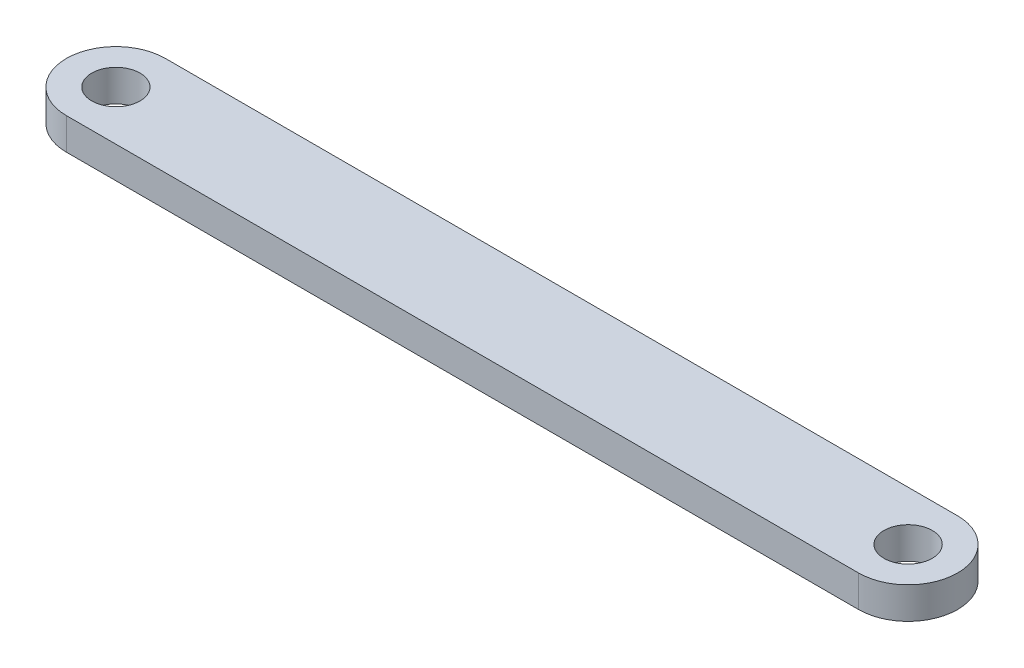
ISO-10303-21;
HEADER;
FILE_DESCRIPTION(('STEP AP214'),'2;1');
FILE_NAME('part.step','',(''),(''),'','','');
FILE_SCHEMA(('AUTOMOTIVE_DESIGN { 1 0 10303 214 1 1 1 1 }'));
ENDSEC;
DATA;
#1=APPLICATION_CONTEXT('core data for automotive mechanical design processes');
#2=APPLICATION_PROTOCOL_DEFINITION('international standard','automotive_design',2000,#1);
#3=PRODUCT_CONTEXT('',#1,'mechanical');
#4=PRODUCT('Part','Part','',(#3));
#5=PRODUCT_RELATED_PRODUCT_CATEGORY('part','',(#4));
#6=PRODUCT_DEFINITION_FORMATION('','',#4);
#7=PRODUCT_DEFINITION_CONTEXT('part definition',#1,'design');
#8=PRODUCT_DEFINITION('design','',#6,#7);
#9=PRODUCT_DEFINITION_SHAPE('','',#8);
#10=(LENGTH_UNIT() NAMED_UNIT(*) SI_UNIT(.MILLI.,.METRE.));
#11=(NAMED_UNIT(*) PLANE_ANGLE_UNIT() SI_UNIT($,.RADIAN.));
#12=(NAMED_UNIT(*) SI_UNIT($,.STERADIAN.) SOLID_ANGLE_UNIT());
#13=UNCERTAINTY_MEASURE_WITH_UNIT(LENGTH_MEASURE(1.E-05),#10,'distance_accuracy_value','');
#14=(GEOMETRIC_REPRESENTATION_CONTEXT(3) GLOBAL_UNCERTAINTY_ASSIGNED_CONTEXT((#13)) GLOBAL_UNIT_ASSIGNED_CONTEXT((#10,
#11,#12)) REPRESENTATION_CONTEXT('',''));
#15=CARTESIAN_POINT('',(0.,0.,0.));
#16=DIRECTION('',(0.,0.,1.));
#17=DIRECTION('',(1.,0.,0.));
#18=AXIS2_PLACEMENT_3D('',#15,#16,#17);
#19=CARTESIAN_POINT('',(0.,8.,0.));
#20=DIRECTION('',(0.,1.,0.));
#21=DIRECTION('',(0.,0.,1.));
#22=AXIS2_PLACEMENT_3D('',#19,#20,#21);
#23=PLANE('',#22);
#24=CARTESIAN_POINT('',(0.,8.,0.));
#25=DIRECTION('',(0.,1.,0.));
#26=DIRECTION('',(0.,0.,1.));
#27=AXIS2_PLACEMENT_3D('',#24,#25,#26);
#28=CIRCLE('',#27,6.1);
#29=CARTESIAN_POINT('',(0.,8.,6.1));
#30=VERTEX_POINT('',#29);
#31=EDGE_CURVE('E104',#30,#30,#28,.T.);
#32=ORIENTED_EDGE('',*,*,#31,.F.);
#33=EDGE_LOOP('',(#32));
#34=FACE_BOUND('',#33,.T.);
#35=CARTESIAN_POINT('',(0.,8.,0.));
#36=DIRECTION('',(0.,1.,0.));
#37=DIRECTION('',(0.,0.,1.));
#38=AXIS2_PLACEMENT_3D('',#35,#36,#37);
#39=CIRCLE('',#38,12.5);
#40=CARTESIAN_POINT('',(0.,8.,-12.5));
#41=VERTEX_POINT('',#40);
#42=CARTESIAN_POINT('',(0.,8.,12.5));
#43=VERTEX_POINT('',#42);
#44=EDGE_CURVE('E89',#41,#43,#39,.T.);
#45=ORIENTED_EDGE('',*,*,#44,.T.);
#46=DIRECTION('',(1.,0.,0.));
#47=VECTOR('',#46,1.);
#48=CARTESIAN_POINT('',(0.,8.,12.5));
#49=LINE('',#48,#47);
#50=CARTESIAN_POINT('',(200.,8.,12.5));
#51=VERTEX_POINT('',#50);
#52=EDGE_CURVE('E84',#43,#51,#49,.T.);
#53=ORIENTED_EDGE('',*,*,#52,.T.);
#54=CARTESIAN_POINT('',(200.,8.,0.));
#55=DIRECTION('',(0.,1.,0.));
#56=DIRECTION('',(0.,0.,1.));
#57=AXIS2_PLACEMENT_3D('',#54,#55,#56);
#58=CIRCLE('',#57,12.5);
#59=CARTESIAN_POINT('',(200.,8.,-12.5));
#60=VERTEX_POINT('',#59);
#61=EDGE_CURVE('E87',#51,#60,#58,.T.);
#62=ORIENTED_EDGE('',*,*,#61,.T.);
#63=DIRECTION('',(-1.,0.,0.));
#64=VECTOR('',#63,1.);
#65=CARTESIAN_POINT('',(0.,8.,-12.5));
#66=LINE('',#65,#64);
#67=EDGE_CURVE('E54',#60,#41,#66,.T.);
#68=ORIENTED_EDGE('',*,*,#67,.T.);
#69=EDGE_LOOP('',(#45,#53,#62,#68));
#70=FACE_BOUND('',#69,.T.);
#71=CARTESIAN_POINT('',(200.,8.,0.));
#72=DIRECTION('',(0.,1.,0.));
#73=DIRECTION('',(0.,0.,1.));
#74=AXIS2_PLACEMENT_3D('',#71,#72,#73);
#75=CIRCLE('',#74,6.09999999999998);
#76=CARTESIAN_POINT('',(200.,8.,6.09999999999998));
#77=VERTEX_POINT('',#76);
#78=EDGE_CURVE('E119',#77,#77,#75,.T.);
#79=ORIENTED_EDGE('',*,*,#78,.F.);
#80=EDGE_LOOP('',(#79));
#81=FACE_BOUND('',#80,.T.);
#82=ADVANCED_FACE('F37',(#34,#70,#81),#23,.T.);
#83=CARTESIAN_POINT('',(0.,0.,0.));
#84=DIRECTION('',(0.,1.,0.));
#85=DIRECTION('',(0.,0.,1.));
#86=AXIS2_PLACEMENT_3D('',#83,#84,#85);
#87=PLANE('',#86);
#88=CARTESIAN_POINT('',(0.,0.,0.));
#89=DIRECTION('',(0.,1.,0.));
#90=DIRECTION('',(0.,0.,1.));
#91=AXIS2_PLACEMENT_3D('',#88,#89,#90);
#92=CIRCLE('',#91,12.5);
#93=CARTESIAN_POINT('',(0.,0.,-12.5));
#94=VERTEX_POINT('',#93);
#95=CARTESIAN_POINT('',(0.,0.,12.5));
#96=VERTEX_POINT('',#95);
#97=EDGE_CURVE('E101',#94,#96,#92,.T.);
#98=ORIENTED_EDGE('',*,*,#97,.F.);
#99=DIRECTION('',(-1.,0.,0.));
#100=VECTOR('',#99,1.);
#101=CARTESIAN_POINT('',(0.,0.,-12.5));
#102=LINE('',#101,#100);
#103=CARTESIAN_POINT('',(200.,0.,-12.5));
#104=VERTEX_POINT('',#103);
#105=EDGE_CURVE('E77',#104,#94,#102,.T.);
#106=ORIENTED_EDGE('',*,*,#105,.F.);
#107=CARTESIAN_POINT('',(200.,0.,0.));
#108=DIRECTION('',(0.,1.,0.));
#109=DIRECTION('',(0.,0.,1.));
#110=AXIS2_PLACEMENT_3D('',#107,#108,#109);
#111=CIRCLE('',#110,12.5);
#112=CARTESIAN_POINT('',(200.,0.,12.5));
#113=VERTEX_POINT('',#112);
#114=EDGE_CURVE('E71',#113,#104,#111,.T.);
#115=ORIENTED_EDGE('',*,*,#114,.F.);
#116=DIRECTION('',(1.,0.,0.));
#117=VECTOR('',#116,1.);
#118=CARTESIAN_POINT('',(0.,0.,12.5));
#119=LINE('',#118,#117);
#120=EDGE_CURVE('E93',#96,#113,#119,.T.);
#121=ORIENTED_EDGE('',*,*,#120,.F.);
#122=EDGE_LOOP('',(#98,#106,#115,#121));
#123=FACE_BOUND('',#122,.T.);
#124=CARTESIAN_POINT('',(0.,0.,0.));
#125=DIRECTION('',(0.,1.,0.));
#126=DIRECTION('',(0.,0.,1.));
#127=AXIS2_PLACEMENT_3D('',#124,#125,#126);
#128=CIRCLE('',#127,6.1);
#129=CARTESIAN_POINT('',(0.,0.,6.1));
#130=VERTEX_POINT('',#129);
#131=EDGE_CURVE('E116',#130,#130,#128,.T.);
#132=ORIENTED_EDGE('',*,*,#131,.T.);
#133=EDGE_LOOP('',(#132));
#134=FACE_BOUND('',#133,.T.);
#135=CARTESIAN_POINT('',(200.,0.,0.));
#136=DIRECTION('',(0.,1.,0.));
#137=DIRECTION('',(0.,0.,1.));
#138=AXIS2_PLACEMENT_3D('',#135,#136,#137);
#139=CIRCLE('',#138,6.09999999999998);
#140=CARTESIAN_POINT('',(200.,0.,6.09999999999998));
#141=VERTEX_POINT('',#140);
#142=EDGE_CURVE('E122',#141,#141,#139,.T.);
#143=ORIENTED_EDGE('',*,*,#142,.T.);
#144=EDGE_LOOP('',(#143));
#145=FACE_BOUND('',#144,.T.);
#146=ADVANCED_FACE('F112',(#123,#134,#145),#87,.F.);
#147=CARTESIAN_POINT('',(0.,8.,0.));
#148=DIRECTION('',(0.,-1.,0.));
#149=DIRECTION('',(0.,0.,-1.));
#150=AXIS2_PLACEMENT_3D('',#147,#148,#149);
#151=CYLINDRICAL_SURFACE('',#150,12.5);
#152=ORIENTED_EDGE('',*,*,#97,.T.);
#153=DIRECTION('',(0.,-1.,0.));
#154=VECTOR('',#153,1.);
#155=CARTESIAN_POINT('',(0.,8.,12.5));
#156=LINE('',#155,#154);
#157=EDGE_CURVE('E11',#43,#96,#156,.T.);
#158=ORIENTED_EDGE('',*,*,#157,.F.);
#159=ORIENTED_EDGE('',*,*,#44,.F.);
#160=DIRECTION('',(0.,-1.,0.));
#161=VECTOR('',#160,1.);
#162=CARTESIAN_POINT('',(0.,8.,-12.5));
#163=LINE('',#162,#161);
#164=EDGE_CURVE('E97',#41,#94,#163,.T.);
#165=ORIENTED_EDGE('',*,*,#164,.T.);
#166=EDGE_LOOP('',(#152,#158,#159,#165));
#167=FACE_BOUND('',#166,.T.);
#168=ADVANCED_FACE('F39',(#167),#151,.T.);
#169=CARTESIAN_POINT('',(0.,8.,12.5));
#170=DIRECTION('',(0.,0.,-1.));
#171=DIRECTION('',(-1.,0.,0.));
#172=AXIS2_PLACEMENT_3D('',#169,#170,#171);
#173=PLANE('',#172);
#174=ORIENTED_EDGE('',*,*,#120,.T.);
#175=DIRECTION('',(0.,-1.,0.));
#176=VECTOR('',#175,1.);
#177=CARTESIAN_POINT('',(200.,8.,12.5));
#178=LINE('',#177,#176);
#179=EDGE_CURVE('E46',#51,#113,#178,.T.);
#180=ORIENTED_EDGE('',*,*,#179,.F.);
#181=ORIENTED_EDGE('',*,*,#52,.F.);
#182=ORIENTED_EDGE('',*,*,#157,.T.);
#183=EDGE_LOOP('',(#174,#180,#181,#182));
#184=FACE_BOUND('',#183,.T.);
#185=ADVANCED_FACE('F92',(#184),#173,.F.);
#186=CARTESIAN_POINT('',(200.,8.,0.));
#187=DIRECTION('',(0.,-1.,0.));
#188=DIRECTION('',(0.,0.,-1.));
#189=AXIS2_PLACEMENT_3D('',#186,#187,#188);
#190=CYLINDRICAL_SURFACE('',#189,12.5);
#191=ORIENTED_EDGE('',*,*,#114,.T.);
#192=DIRECTION('',(0.,-1.,0.));
#193=VECTOR('',#192,1.);
#194=CARTESIAN_POINT('',(200.,8.,-12.5));
#195=LINE('',#194,#193);
#196=EDGE_CURVE('E94',#60,#104,#195,.T.);
#197=ORIENTED_EDGE('',*,*,#196,.F.);
#198=ORIENTED_EDGE('',*,*,#61,.F.);
#199=ORIENTED_EDGE('',*,*,#179,.T.);
#200=EDGE_LOOP('',(#191,#197,#198,#199));
#201=FACE_BOUND('',#200,.T.);
#202=ADVANCED_FACE('F95',(#201),#190,.T.);
#203=CARTESIAN_POINT('',(0.,8.,-12.5));
#204=DIRECTION('',(0.,0.,1.));
#205=DIRECTION('',(1.,0.,0.));
#206=AXIS2_PLACEMENT_3D('',#203,#204,#205);
#207=PLANE('',#206);
#208=ORIENTED_EDGE('',*,*,#105,.T.);
#209=ORIENTED_EDGE('',*,*,#164,.F.);
#210=ORIENTED_EDGE('',*,*,#67,.F.);
#211=ORIENTED_EDGE('',*,*,#196,.T.);
#212=EDGE_LOOP('',(#208,#209,#210,#211));
#213=FACE_BOUND('',#212,.T.);
#214=ADVANCED_FACE('F109',(#213),#207,.F.);
#215=CARTESIAN_POINT('',(0.,8.,0.));
#216=DIRECTION('',(0.,-1.,0.));
#217=DIRECTION('',(0.,0.,-1.));
#218=AXIS2_PLACEMENT_3D('',#215,#216,#217);
#219=CYLINDRICAL_SURFACE('',#218,6.1);
#220=ORIENTED_EDGE('',*,*,#31,.T.);
#221=EDGE_LOOP('',(#220));
#222=FACE_BOUND('',#221,.T.);
#223=ORIENTED_EDGE('',*,*,#131,.F.);
#224=EDGE_LOOP('',(#223));
#225=FACE_BOUND('',#224,.T.);
#226=ADVANCED_FACE('F139',(#222,#225),#219,.F.);
#227=CARTESIAN_POINT('',(200.,8.,0.));
#228=DIRECTION('',(0.,-1.,0.));
#229=DIRECTION('',(0.,0.,-1.));
#230=AXIS2_PLACEMENT_3D('',#227,#228,#229);
#231=CYLINDRICAL_SURFACE('',#230,6.09999999999998);
#232=ORIENTED_EDGE('',*,*,#78,.T.);
#233=EDGE_LOOP('',(#232));
#234=FACE_BOUND('',#233,.T.);
#235=ORIENTED_EDGE('',*,*,#142,.F.);
#236=EDGE_LOOP('',(#235));
#237=FACE_BOUND('',#236,.T.);
#238=ADVANCED_FACE('F128',(#234,#237),#231,.F.);
#239=CLOSED_SHELL('',(#82,#146,#168,#185,#202,#214,#226,#238));
#240=MANIFOLD_SOLID_BREP('B2',#239);
#241=ADVANCED_BREP_SHAPE_REPRESENTATION('',(#18,#240),#14);
#242=SHAPE_DEFINITION_REPRESENTATION(#9,#241);
ENDSEC;
END-ISO-10303-21;
